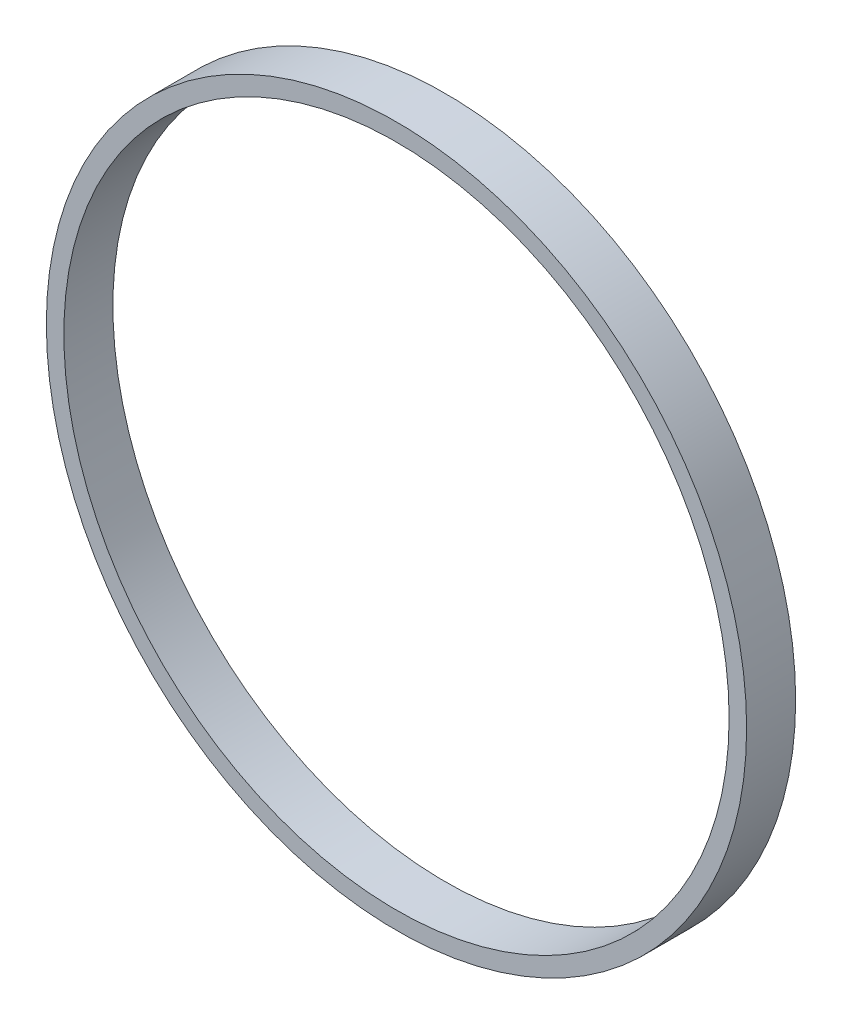
ISO-10303-21;
HEADER;
FILE_DESCRIPTION(('STEP AP214'),'2;1');
FILE_NAME('part.step','',(''),(''),'','','');
FILE_SCHEMA(('AUTOMOTIVE_DESIGN { 1 0 10303 214 1 1 1 1 }'));
ENDSEC;
DATA;
#1=APPLICATION_CONTEXT('core data for automotive mechanical design processes');
#2=APPLICATION_PROTOCOL_DEFINITION('international standard','automotive_design',2000,#1);
#3=PRODUCT_CONTEXT('',#1,'mechanical');
#4=PRODUCT('Part','Part','',(#3));
#5=PRODUCT_RELATED_PRODUCT_CATEGORY('part','',(#4));
#6=PRODUCT_DEFINITION_FORMATION('','',#4);
#7=PRODUCT_DEFINITION_CONTEXT('part definition',#1,'design');
#8=PRODUCT_DEFINITION('design','',#6,#7);
#9=PRODUCT_DEFINITION_SHAPE('','',#8);
#10=(LENGTH_UNIT() NAMED_UNIT(*) SI_UNIT(.MILLI.,.METRE.));
#11=(NAMED_UNIT(*) PLANE_ANGLE_UNIT() SI_UNIT($,.RADIAN.));
#12=(NAMED_UNIT(*) SI_UNIT($,.STERADIAN.) SOLID_ANGLE_UNIT());
#13=UNCERTAINTY_MEASURE_WITH_UNIT(LENGTH_MEASURE(1.E-05),#10,'distance_accuracy_value','');
#14=(GEOMETRIC_REPRESENTATION_CONTEXT(3) GLOBAL_UNCERTAINTY_ASSIGNED_CONTEXT((#13)) GLOBAL_UNIT_ASSIGNED_CONTEXT((#10,
#11,#12)) REPRESENTATION_CONTEXT('',''));
#15=CARTESIAN_POINT('',(0.,0.,0.));
#16=DIRECTION('',(0.,0.,1.));
#17=DIRECTION('',(1.,0.,0.));
#18=AXIS2_PLACEMENT_3D('',#15,#16,#17);
#19=CARTESIAN_POINT('',(0.,0.,7.));
#20=DIRECTION('',(0.,0.,-1.));
#21=DIRECTION('',(-1.,0.,0.));
#22=AXIS2_PLACEMENT_3D('',#19,#20,#21);
#23=CYLINDRICAL_SURFACE('',#22,50.);
#24=CARTESIAN_POINT('',(0.,0.,7.));
#25=DIRECTION('',(0.,0.,1.));
#26=DIRECTION('',(1.,0.,0.));
#27=AXIS2_PLACEMENT_3D('',#24,#25,#26);
#28=CIRCLE('',#27,50.);
#29=CARTESIAN_POINT('',(50.,0.,7.));
#30=VERTEX_POINT('',#29);
#31=EDGE_CURVE('E10',#30,#30,#28,.T.);
#32=ORIENTED_EDGE('',*,*,#31,.F.);
#33=EDGE_LOOP('',(#32));
#34=FACE_BOUND('',#33,.T.);
#35=CARTESIAN_POINT('',(0.,0.,0.));
#36=DIRECTION('',(0.,0.,1.));
#37=DIRECTION('',(1.,0.,0.));
#38=AXIS2_PLACEMENT_3D('',#35,#36,#37);
#39=CIRCLE('',#38,50.);
#40=CARTESIAN_POINT('',(50.,0.,0.));
#41=VERTEX_POINT('',#40);
#42=EDGE_CURVE('E46',#41,#41,#39,.T.);
#43=ORIENTED_EDGE('',*,*,#42,.T.);
#44=EDGE_LOOP('',(#43));
#45=FACE_BOUND('',#44,.T.);
#46=ADVANCED_FACE('F43',(#34,#45),#23,.T.);
#47=CARTESIAN_POINT('',(0.,0.,7.));
#48=DIRECTION('',(0.,0.,1.));
#49=DIRECTION('',(1.,0.,0.));
#50=AXIS2_PLACEMENT_3D('',#47,#48,#49);
#51=PLANE('',#50);
#52=CARTESIAN_POINT('',(0.,0.,7.));
#53=DIRECTION('',(0.,0.,1.));
#54=DIRECTION('',(1.,0.,0.));
#55=AXIS2_PLACEMENT_3D('',#52,#53,#54);
#56=CIRCLE('',#55,47.5);
#57=CARTESIAN_POINT('',(47.5,0.,7.));
#58=VERTEX_POINT('',#57);
#59=EDGE_CURVE('E57',#58,#58,#56,.T.);
#60=ORIENTED_EDGE('',*,*,#59,.F.);
#61=EDGE_LOOP('',(#60));
#62=FACE_BOUND('',#61,.T.);
#63=ORIENTED_EDGE('',*,*,#31,.T.);
#64=EDGE_LOOP('',(#63));
#65=FACE_BOUND('',#64,.T.);
#66=ADVANCED_FACE('F74',(#62,#65),#51,.T.);
#67=CARTESIAN_POINT('',(0.,0.,0.));
#68=DIRECTION('',(0.,0.,1.));
#69=DIRECTION('',(1.,0.,0.));
#70=AXIS2_PLACEMENT_3D('',#67,#68,#69);
#71=PLANE('',#70);
#72=CARTESIAN_POINT('',(0.,0.,0.));
#73=DIRECTION('',(0.,0.,1.));
#74=DIRECTION('',(1.,0.,0.));
#75=AXIS2_PLACEMENT_3D('',#72,#73,#74);
#76=CIRCLE('',#75,47.5);
#77=CARTESIAN_POINT('',(47.5,0.,0.));
#78=VERTEX_POINT('',#77);
#79=EDGE_CURVE('E55',#78,#78,#76,.T.);
#80=ORIENTED_EDGE('',*,*,#79,.T.);
#81=EDGE_LOOP('',(#80));
#82=FACE_BOUND('',#81,.T.);
#83=ORIENTED_EDGE('',*,*,#42,.F.);
#84=EDGE_LOOP('',(#83));
#85=FACE_BOUND('',#84,.T.);
#86=ADVANCED_FACE('F65',(#82,#85),#71,.F.);
#87=CARTESIAN_POINT('',(0.,0.,0.));
#88=DIRECTION('',(0.,0.,1.));
#89=DIRECTION('',(1.,0.,0.));
#90=AXIS2_PLACEMENT_3D('',#87,#88,#89);
#91=CYLINDRICAL_SURFACE('',#90,47.5);
#92=ORIENTED_EDGE('',*,*,#79,.F.);
#93=EDGE_LOOP('',(#92));
#94=FACE_BOUND('',#93,.T.);
#95=ORIENTED_EDGE('',*,*,#59,.T.);
#96=EDGE_LOOP('',(#95));
#97=FACE_BOUND('',#96,.T.);
#98=ADVANCED_FACE('F68',(#94,#97),#91,.F.);
#99=CLOSED_SHELL('',(#46,#66,#86,#98));
#100=MANIFOLD_SOLID_BREP('B2',#99);
#101=ADVANCED_BREP_SHAPE_REPRESENTATION('',(#18,#100),#14);
#102=SHAPE_DEFINITION_REPRESENTATION(#9,#101);
ENDSEC;
END-ISO-10303-21;
